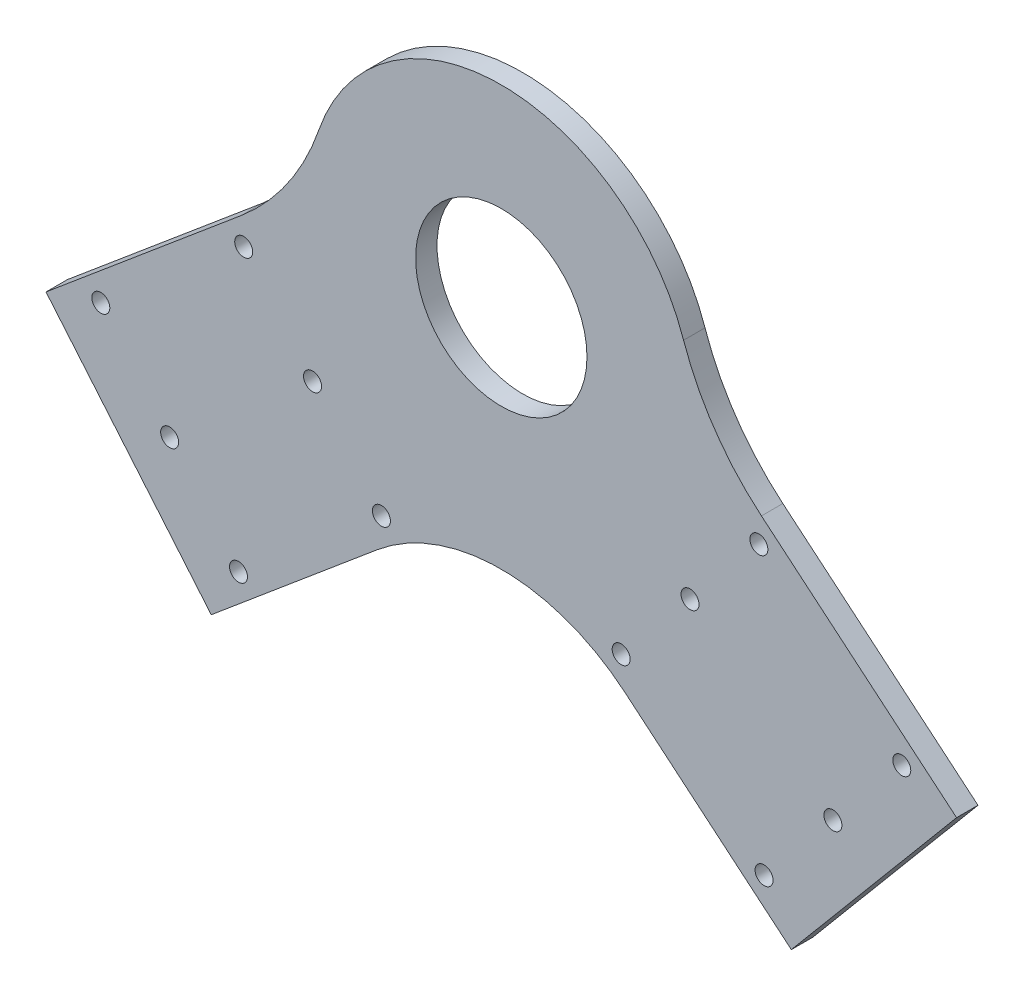
ISO-10303-21;
HEADER;
FILE_DESCRIPTION(('STEP AP214'),'2;1');
FILE_NAME('part.step','',(''),(''),'','','');
FILE_SCHEMA(('AUTOMOTIVE_DESIGN { 1 0 10303 214 1 1 1 1 }'));
ENDSEC;
DATA;
#1=APPLICATION_CONTEXT('core data for automotive mechanical design processes');
#2=APPLICATION_PROTOCOL_DEFINITION('international standard','automotive_design',2000,#1);
#3=PRODUCT_CONTEXT('',#1,'mechanical');
#4=PRODUCT('Part','Part','',(#3));
#5=PRODUCT_RELATED_PRODUCT_CATEGORY('part','',(#4));
#6=PRODUCT_DEFINITION_FORMATION('','',#4);
#7=PRODUCT_DEFINITION_CONTEXT('part definition',#1,'design');
#8=PRODUCT_DEFINITION('design','',#6,#7);
#9=PRODUCT_DEFINITION_SHAPE('','',#8);
#10=(LENGTH_UNIT() NAMED_UNIT(*) SI_UNIT(.MILLI.,.METRE.));
#11=(NAMED_UNIT(*) PLANE_ANGLE_UNIT() SI_UNIT($,.RADIAN.));
#12=(NAMED_UNIT(*) SI_UNIT($,.STERADIAN.) SOLID_ANGLE_UNIT());
#13=UNCERTAINTY_MEASURE_WITH_UNIT(LENGTH_MEASURE(1.E-05),#10,'distance_accuracy_value','');
#14=(GEOMETRIC_REPRESENTATION_CONTEXT(3) GLOBAL_UNCERTAINTY_ASSIGNED_CONTEXT((#13)) GLOBAL_UNIT_ASSIGNED_CONTEXT((#10,
#11,#12)) REPRESENTATION_CONTEXT('',''));
#15=CARTESIAN_POINT('',(0.,0.,0.));
#16=DIRECTION('',(0.,0.,1.));
#17=DIRECTION('',(1.,0.,0.));
#18=AXIS2_PLACEMENT_3D('',#15,#16,#17);
#19=CARTESIAN_POINT('',(0.,0.,5.));
#20=DIRECTION('',(0.,0.,-1.));
#21=DIRECTION('',(-1.,0.,0.));
#22=AXIS2_PLACEMENT_3D('',#19,#20,#21);
#23=CYLINDRICAL_SURFACE('',#22,45.);
#24=CARTESIAN_POINT('',(0.,0.,5.));
#25=DIRECTION('',(0.,0.,1.));
#26=DIRECTION('',(1.,0.,0.));
#27=AXIS2_PLACEMENT_3D('',#24,#25,#26);
#28=CIRCLE('',#27,45.);
#29=CARTESIAN_POINT('',(42.5490311383006,14.6485476820034,5.));
#30=VERTEX_POINT('',#29);
#31=CARTESIAN_POINT('',(-42.5490311383006,14.6485476820034,5.));
#32=VERTEX_POINT('',#31);
#33=EDGE_CURVE('E151',#30,#32,#28,.T.);
#34=ORIENTED_EDGE('',*,*,#33,.F.);
#35=DIRECTION('',(0.,0.,-1.));
#36=VECTOR('',#35,1.);
#37=CARTESIAN_POINT('',(42.5490311383006,14.6485476820034,5.));
#38=LINE('',#37,#36);
#39=CARTESIAN_POINT('',(42.5490311383006,14.6485476820034,0.));
#40=VERTEX_POINT('',#39);
#41=EDGE_CURVE('E305',#30,#40,#38,.T.);
#42=ORIENTED_EDGE('',*,*,#41,.T.);
#43=CARTESIAN_POINT('',(0.,0.,0.));
#44=DIRECTION('',(0.,0.,1.));
#45=DIRECTION('',(1.,0.,0.));
#46=AXIS2_PLACEMENT_3D('',#43,#44,#45);
#47=CIRCLE('',#46,45.);
#48=CARTESIAN_POINT('',(-42.5490311383006,14.6485476820034,0.));
#49=VERTEX_POINT('',#48);
#50=EDGE_CURVE('E224',#40,#49,#47,.T.);
#51=ORIENTED_EDGE('',*,*,#50,.T.);
#52=DIRECTION('',(0.,0.,-1.));
#53=VECTOR('',#52,1.);
#54=CARTESIAN_POINT('',(-42.5490311383006,14.6485476820034,5.));
#55=LINE('',#54,#53);
#56=EDGE_CURVE('E138',#49,#32,#55,.F.);
#57=ORIENTED_EDGE('',*,*,#56,.T.);
#58=EDGE_LOOP('',(#34,#42,#51,#57));
#59=FACE_BOUND('',#58,.T.);
#60=ADVANCED_FACE('F47',(#59),#23,.T.);
#61=CARTESIAN_POINT('',(-19.2836282905963,22.9813332935692,5.));
#62=DIRECTION('',(-0.642787609686544,0.766044443118974,0.));
#63=DIRECTION('',(-0.766044443118974,-0.642787609686544,0.));
#64=AXIS2_PLACEMENT_3D('',#61,#62,#63);
#65=PLANE('',#64);
#66=DIRECTION('',(0.766044443118974,0.642787609686544,0.));
#67=VECTOR('',#66,1.);
#68=CARTESIAN_POINT('',(-19.2836282905963,22.9813332935692,5.));
#69=LINE('',#68,#67);
#70=CARTESIAN_POINT('',(-106.261095469114,-50.0014273366601,5.));
#71=VERTEX_POINT('',#70);
#72=CARTESIAN_POINT('',(-60.7138160748421,-11.7827219957973,5.));
#73=VERTEX_POINT('',#72);
#74=EDGE_CURVE('E129',#71,#73,#69,.T.);
#75=ORIENTED_EDGE('',*,*,#74,.T.);
#76=DIRECTION('',(0.,0.,-1.));
#77=VECTOR('',#76,1.);
#78=CARTESIAN_POINT('',(-60.7138160748421,-11.7827219957973,5.));
#79=LINE('',#78,#77);
#80=CARTESIAN_POINT('',(-60.7138160748421,-11.7827219957973,0.));
#81=VERTEX_POINT('',#80);
#82=EDGE_CURVE('E312',#73,#81,#79,.T.);
#83=ORIENTED_EDGE('',*,*,#82,.T.);
#84=DIRECTION('',(0.766044443118974,0.642787609686544,0.));
#85=VECTOR('',#84,1.);
#86=CARTESIAN_POINT('',(-19.2836282905963,22.9813332935692,0.));
#87=LINE('',#86,#85);
#88=CARTESIAN_POINT('',(-106.261095469114,-50.0014273366601,0.));
#89=VERTEX_POINT('',#88);
#90=EDGE_CURVE('E132',#89,#81,#87,.T.);
#91=ORIENTED_EDGE('',*,*,#90,.F.);
#92=DIRECTION('',(0.,0.,-1.));
#93=VECTOR('',#92,1.);
#94=CARTESIAN_POINT('',(-106.261095469114,-50.0014273366601,5.));
#95=LINE('',#94,#93);
#96=EDGE_CURVE('E125',#71,#89,#95,.T.);
#97=ORIENTED_EDGE('',*,*,#96,.F.);
#98=EDGE_LOOP('',(#75,#83,#91,#97));
#99=FACE_BOUND('',#98,.T.);
#100=ADVANCED_FACE('F127',(#99),#65,.T.);
#101=CARTESIAN_POINT('',(-86.9774671785178,-72.9827606302294,5.));
#102=DIRECTION('',(-0.766044443118973,-0.642787609686545,0.));
#103=DIRECTION('',(0.642787609686545,-0.766044443118973,0.));
#104=AXIS2_PLACEMENT_3D('',#101,#102,#103);
#105=PLANE('',#104);
#106=DIRECTION('',(-0.642787609686545,0.766044443118973,0.));
#107=VECTOR('',#106,1.);
#108=CARTESIAN_POINT('',(-86.9774671785178,-72.9827606302294,0.));
#109=LINE('',#108,#107);
#110=CARTESIAN_POINT('',(-67.6938388879215,-95.9640939237985,0.));
#111=VERTEX_POINT('',#110);
#112=EDGE_CURVE('E230',#111,#89,#109,.T.);
#113=ORIENTED_EDGE('',*,*,#112,.F.);
#114=DIRECTION('',(0.,0.,-1.));
#115=VECTOR('',#114,1.);
#116=CARTESIAN_POINT('',(-67.6938388879215,-95.9640939237985,5.));
#117=LINE('',#116,#115);
#118=CARTESIAN_POINT('',(-67.6938388879215,-95.9640939237985,5.));
#119=VERTEX_POINT('',#118);
#120=EDGE_CURVE('E139',#119,#111,#117,.T.);
#121=ORIENTED_EDGE('',*,*,#120,.F.);
#122=DIRECTION('',(-0.642787609686545,0.766044443118973,0.));
#123=VECTOR('',#122,1.);
#124=CARTESIAN_POINT('',(-86.9774671785178,-72.9827606302294,5.));
#125=LINE('',#124,#123);
#126=EDGE_CURVE('E146',#119,#71,#125,.T.);
#127=ORIENTED_EDGE('',*,*,#126,.T.);
#128=ORIENTED_EDGE('',*,*,#96,.T.);
#129=EDGE_LOOP('',(#113,#121,#127,#128));
#130=FACE_BOUND('',#129,.T.);
#131=ADVANCED_FACE('F153',(#130),#105,.T.);
#132=CARTESIAN_POINT('',(19.2836282905963,-22.9813332935693,5.));
#133=DIRECTION('',(-0.642787609686543,0.766044443118975,0.));
#134=DIRECTION('',(-0.766044443118975,-0.642787609686543,0.));
#135=AXIS2_PLACEMENT_3D('',#132,#133,#134);
#136=PLANE('',#135);
#137=DIRECTION('',(0.766044443118975,0.642787609686543,0.));
#138=VECTOR('',#137,1.);
#139=CARTESIAN_POINT('',(19.2836282905963,-22.9813332935693,0.));
#140=LINE('',#139,#138);
#141=CARTESIAN_POINT('',(-28.9254424358944,-63.4335467595675,0.));
#142=VERTEX_POINT('',#141);
#143=EDGE_CURVE('E233',#111,#142,#140,.T.);
#144=ORIENTED_EDGE('',*,*,#143,.T.);
#145=DIRECTION('',(0.,0.,-1.));
#146=VECTOR('',#145,1.);
#147=CARTESIAN_POINT('',(-28.9254424358944,-63.4335467595675,5.));
#148=LINE('',#147,#146);
#149=CARTESIAN_POINT('',(-28.9254424358944,-63.4335467595675,5.));
#150=VERTEX_POINT('',#149);
#151=EDGE_CURVE('E63',#142,#150,#148,.F.);
#152=ORIENTED_EDGE('',*,*,#151,.T.);
#153=DIRECTION('',(0.766044443118975,0.642787609686543,0.));
#154=VECTOR('',#153,1.);
#155=CARTESIAN_POINT('',(19.2836282905963,-22.9813332935693,5.));
#156=LINE('',#155,#154);
#157=EDGE_CURVE('E155',#119,#150,#156,.T.);
#158=ORIENTED_EDGE('',*,*,#157,.F.);
#159=ORIENTED_EDGE('',*,*,#120,.T.);
#160=EDGE_LOOP('',(#144,#152,#158,#159));
#161=FACE_BOUND('',#160,.T.);
#162=ADVANCED_FACE('F400',(#161),#136,.F.);
#163=CARTESIAN_POINT('',(-19.2836282905963,-22.9813332935693,5.));
#164=DIRECTION('',(-0.642787609686543,-0.766044443118975,0.));
#165=DIRECTION('',(0.766044443118975,-0.642787609686543,0.));
#166=AXIS2_PLACEMENT_3D('',#163,#164,#165);
#167=PLANE('',#166);
#168=DIRECTION('',(-0.766044443118975,0.642787609686543,0.));
#169=VECTOR('',#168,1.);
#170=CARTESIAN_POINT('',(-19.2836282905963,-22.9813332935693,5.));
#171=LINE('',#170,#169);
#172=CARTESIAN_POINT('',(67.6938388879215,-95.9640939237985,5.));
#173=VERTEX_POINT('',#172);
#174=CARTESIAN_POINT('',(28.9254424358944,-63.4335467595675,5.));
#175=VERTEX_POINT('',#174);
#176=EDGE_CURVE('E158',#173,#175,#171,.T.);
#177=ORIENTED_EDGE('',*,*,#176,.T.);
#178=DIRECTION('',(0.,0.,-1.));
#179=VECTOR('',#178,1.);
#180=CARTESIAN_POINT('',(28.9254424358944,-63.4335467595675,5.));
#181=LINE('',#180,#179);
#182=CARTESIAN_POINT('',(28.9254424358944,-63.4335467595675,0.));
#183=VERTEX_POINT('',#182);
#184=EDGE_CURVE('E326',#175,#183,#181,.T.);
#185=ORIENTED_EDGE('',*,*,#184,.T.);
#186=DIRECTION('',(-0.766044443118975,0.642787609686543,0.));
#187=VECTOR('',#186,1.);
#188=CARTESIAN_POINT('',(-19.2836282905963,-22.9813332935693,0.));
#189=LINE('',#188,#187);
#190=CARTESIAN_POINT('',(67.6938388879215,-95.9640939237985,0.));
#191=VERTEX_POINT('',#190);
#192=EDGE_CURVE('E236',#191,#183,#189,.T.);
#193=ORIENTED_EDGE('',*,*,#192,.F.);
#194=DIRECTION('',(0.,0.,-1.));
#195=VECTOR('',#194,1.);
#196=CARTESIAN_POINT('',(67.6938388879215,-95.9640939237985,5.));
#197=LINE('',#196,#195);
#198=EDGE_CURVE('E298',#173,#191,#197,.T.);
#199=ORIENTED_EDGE('',*,*,#198,.F.);
#200=EDGE_LOOP('',(#177,#185,#193,#199));
#201=FACE_BOUND('',#200,.T.);
#202=ADVANCED_FACE('F335',(#201),#167,.T.);
#203=CARTESIAN_POINT('',(86.9774671785178,-72.9827606302294,5.));
#204=DIRECTION('',(-0.766044443118973,0.642787609686545,0.));
#205=DIRECTION('',(-0.642787609686545,-0.766044443118973,0.));
#206=AXIS2_PLACEMENT_3D('',#203,#204,#205);
#207=PLANE('',#206);
#208=DIRECTION('',(0.642787609686545,0.766044443118973,0.));
#209=VECTOR('',#208,1.);
#210=CARTESIAN_POINT('',(86.9774671785178,-72.9827606302294,0.));
#211=LINE('',#210,#209);
#212=CARTESIAN_POINT('',(106.261095469114,-50.0014273366601,0.));
#213=VERTEX_POINT('',#212);
#214=EDGE_CURVE('E239',#191,#213,#211,.T.);
#215=ORIENTED_EDGE('',*,*,#214,.T.);
#216=DIRECTION('',(0.,0.,-1.));
#217=VECTOR('',#216,1.);
#218=CARTESIAN_POINT('',(106.261095469114,-50.0014273366601,5.));
#219=LINE('',#218,#217);
#220=CARTESIAN_POINT('',(106.261095469114,-50.0014273366601,5.));
#221=VERTEX_POINT('',#220);
#222=EDGE_CURVE('E219',#221,#213,#219,.T.);
#223=ORIENTED_EDGE('',*,*,#222,.F.);
#224=DIRECTION('',(0.642787609686545,0.766044443118973,0.));
#225=VECTOR('',#224,1.);
#226=CARTESIAN_POINT('',(86.9774671785178,-72.9827606302294,5.));
#227=LINE('',#226,#225);
#228=EDGE_CURVE('E165',#173,#221,#227,.T.);
#229=ORIENTED_EDGE('',*,*,#228,.F.);
#230=ORIENTED_EDGE('',*,*,#198,.T.);
#231=EDGE_LOOP('',(#215,#223,#229,#230));
#232=FACE_BOUND('',#231,.T.);
#233=ADVANCED_FACE('F346',(#232),#207,.F.);
#234=CARTESIAN_POINT('',(77.4019116395307,-64.9479155091474,5.));
#235=DIRECTION('',(0.,0.,-1.));
#236=DIRECTION('',(-1.,0.,0.));
#237=AXIS2_PLACEMENT_3D('',#234,#235,#236);
#238=CYLINDRICAL_SURFACE('',#237,2.1);
#239=CARTESIAN_POINT('',(77.4019116395307,-64.9479155091474,5.));
#240=DIRECTION('',(0.,0.,1.));
#241=DIRECTION('',(1.,0.,0.));
#242=AXIS2_PLACEMENT_3D('',#239,#240,#241);
#243=CIRCLE('',#242,2.1);
#244=CARTESIAN_POINT('',(79.5019116395307,-64.9479155091474,5.));
#245=VERTEX_POINT('',#244);
#246=EDGE_CURVE('E211',#245,#245,#243,.T.);
#247=ORIENTED_EDGE('',*,*,#246,.T.);
#248=EDGE_LOOP('',(#247));
#249=FACE_BOUND('',#248,.T.);
#250=CARTESIAN_POINT('',(77.4019116395307,-64.9479155091474,0.));
#251=DIRECTION('',(0.,0.,1.));
#252=DIRECTION('',(1.,0.,0.));
#253=AXIS2_PLACEMENT_3D('',#250,#251,#252);
#254=CIRCLE('',#253,2.1);
#255=CARTESIAN_POINT('',(79.5019116395307,-64.9479155091474,0.));
#256=VERTEX_POINT('',#255);
#257=EDGE_CURVE('E286',#256,#256,#254,.T.);
#258=ORIENTED_EDGE('',*,*,#257,.F.);
#259=EDGE_LOOP('',(#258));
#260=FACE_BOUND('',#259,.T.);
#261=ADVANCED_FACE('F409',(#249,#260),#238,.F.);
#262=CARTESIAN_POINT('',(61.3322213973671,-84.0990265871218,5.));
#263=DIRECTION('',(0.,0.,-1.));
#264=DIRECTION('',(-1.,0.,0.));
#265=AXIS2_PLACEMENT_3D('',#262,#263,#264);
#266=CYLINDRICAL_SURFACE('',#265,2.1);
#267=CARTESIAN_POINT('',(61.3322213973671,-84.0990265871218,5.));
#268=DIRECTION('',(0.,0.,1.));
#269=DIRECTION('',(1.,0.,0.));
#270=AXIS2_PLACEMENT_3D('',#267,#268,#269);
#271=CIRCLE('',#270,2.1);
#272=CARTESIAN_POINT('',(63.4322213973671,-84.0990265871218,5.));
#273=VERTEX_POINT('',#272);
#274=EDGE_CURVE('E207',#273,#273,#271,.T.);
#275=ORIENTED_EDGE('',*,*,#274,.T.);
#276=EDGE_LOOP('',(#275));
#277=FACE_BOUND('',#276,.T.);
#278=CARTESIAN_POINT('',(61.3322213973671,-84.0990265871218,0.));
#279=DIRECTION('',(0.,0.,1.));
#280=DIRECTION('',(1.,0.,0.));
#281=AXIS2_PLACEMENT_3D('',#278,#279,#280);
#282=CIRCLE('',#281,2.1);
#283=CARTESIAN_POINT('',(63.4322213973671,-84.0990265871218,0.));
#284=VERTEX_POINT('',#283);
#285=EDGE_CURVE('E282',#284,#284,#282,.T.);
#286=ORIENTED_EDGE('',*,*,#285,.F.);
#287=EDGE_LOOP('',(#286));
#288=FACE_BOUND('',#287,.T.);
#289=ADVANCED_FACE('F447',(#277,#288),#266,.F.);
#290=CARTESIAN_POINT('',(60.1180268282942,-17.809831905421,5.));
#291=DIRECTION('',(0.,0.,-1.));
#292=DIRECTION('',(-1.,0.,0.));
#293=AXIS2_PLACEMENT_3D('',#290,#291,#292);
#294=CYLINDRICAL_SURFACE('',#293,2.1);
#295=CARTESIAN_POINT('',(60.1180268282942,-17.809831905421,5.));
#296=DIRECTION('',(0.,0.,1.));
#297=DIRECTION('',(1.,0.,0.));
#298=AXIS2_PLACEMENT_3D('',#295,#296,#297);
#299=CIRCLE('',#298,2.1);
#300=CARTESIAN_POINT('',(62.2180268282941,-17.809831905421,5.));
#301=VERTEX_POINT('',#300);
#302=EDGE_CURVE('E203',#301,#301,#299,.T.);
#303=ORIENTED_EDGE('',*,*,#302,.T.);
#304=EDGE_LOOP('',(#303));
#305=FACE_BOUND('',#304,.T.);
#306=CARTESIAN_POINT('',(60.1180268282942,-17.809831905421,0.));
#307=DIRECTION('',(0.,0.,1.));
#308=DIRECTION('',(1.,0.,0.));
#309=AXIS2_PLACEMENT_3D('',#306,#307,#308);
#310=CIRCLE('',#309,2.1);
#311=CARTESIAN_POINT('',(62.2180268282941,-17.809831905421,0.));
#312=VERTEX_POINT('',#311);
#313=EDGE_CURVE('E278',#312,#312,#310,.T.);
#314=ORIENTED_EDGE('',*,*,#313,.F.);
#315=EDGE_LOOP('',(#314));
#316=FACE_BOUND('',#315,.T.);
#317=ADVANCED_FACE('F443',(#305,#316),#294,.F.);
#318=CARTESIAN_POINT('',(44.0483365861306,-36.9609429833953,5.));
#319=DIRECTION('',(0.,0.,-1.));
#320=DIRECTION('',(-1.,0.,0.));
#321=AXIS2_PLACEMENT_3D('',#318,#319,#320);
#322=CYLINDRICAL_SURFACE('',#321,2.1);
#323=CARTESIAN_POINT('',(44.0483365861306,-36.9609429833953,5.));
#324=DIRECTION('',(0.,0.,1.));
#325=DIRECTION('',(1.,0.,0.));
#326=AXIS2_PLACEMENT_3D('',#323,#324,#325);
#327=CIRCLE('',#326,2.1);
#328=CARTESIAN_POINT('',(46.1483365861306,-36.9609429833953,5.));
#329=VERTEX_POINT('',#328);
#330=EDGE_CURVE('E199',#329,#329,#327,.T.);
#331=ORIENTED_EDGE('',*,*,#330,.T.);
#332=EDGE_LOOP('',(#331));
#333=FACE_BOUND('',#332,.T.);
#334=CARTESIAN_POINT('',(44.0483365861306,-36.9609429833953,0.));
#335=DIRECTION('',(0.,0.,1.));
#336=DIRECTION('',(1.,0.,0.));
#337=AXIS2_PLACEMENT_3D('',#334,#335,#336);
#338=CIRCLE('',#337,2.1);
#339=CARTESIAN_POINT('',(46.1483365861306,-36.9609429833953,0.));
#340=VERTEX_POINT('',#339);
#341=EDGE_CURVE('E274',#340,#340,#338,.T.);
#342=ORIENTED_EDGE('',*,*,#341,.F.);
#343=EDGE_LOOP('',(#342));
#344=FACE_BOUND('',#343,.T.);
#345=ADVANCED_FACE('F439',(#333,#344),#322,.F.);
#346=CARTESIAN_POINT('',(27.978646343967,-56.1120540613696,5.));
#347=DIRECTION('',(0.,0.,-1.));
#348=DIRECTION('',(-1.,0.,0.));
#349=AXIS2_PLACEMENT_3D('',#346,#347,#348);
#350=CYLINDRICAL_SURFACE('',#349,2.1);
#351=CARTESIAN_POINT('',(27.978646343967,-56.1120540613696,5.));
#352=DIRECTION('',(0.,0.,1.));
#353=DIRECTION('',(1.,0.,0.));
#354=AXIS2_PLACEMENT_3D('',#351,#352,#353);
#355=CIRCLE('',#354,2.1);
#356=CARTESIAN_POINT('',(30.078646343967,-56.1120540613696,5.));
#357=VERTEX_POINT('',#356);
#358=EDGE_CURVE('E195',#357,#357,#355,.T.);
#359=ORIENTED_EDGE('',*,*,#358,.T.);
#360=EDGE_LOOP('',(#359));
#361=FACE_BOUND('',#360,.T.);
#362=CARTESIAN_POINT('',(27.978646343967,-56.1120540613696,0.));
#363=DIRECTION('',(0.,0.,1.));
#364=DIRECTION('',(1.,0.,0.));
#365=AXIS2_PLACEMENT_3D('',#362,#363,#364);
#366=CIRCLE('',#365,2.1);
#367=CARTESIAN_POINT('',(30.078646343967,-56.1120540613696,0.));
#368=VERTEX_POINT('',#367);
#369=EDGE_CURVE('E270',#368,#368,#366,.T.);
#370=ORIENTED_EDGE('',*,*,#369,.F.);
#371=EDGE_LOOP('',(#370));
#372=FACE_BOUND('',#371,.T.);
#373=ADVANCED_FACE('F435',(#361,#372),#350,.F.);
#374=CARTESIAN_POINT('',(-60.1180268282942,-17.809831905421,5.));
#375=DIRECTION('',(0.,0.,-1.));
#376=DIRECTION('',(-1.,0.,0.));
#377=AXIS2_PLACEMENT_3D('',#374,#375,#376);
#378=CYLINDRICAL_SURFACE('',#377,2.1);
#379=CARTESIAN_POINT('',(-60.1180268282942,-17.809831905421,5.));
#380=DIRECTION('',(0.,0.,1.));
#381=DIRECTION('',(1.,0.,0.));
#382=AXIS2_PLACEMENT_3D('',#379,#380,#381);
#383=CIRCLE('',#382,2.1);
#384=CARTESIAN_POINT('',(-58.0180268282942,-17.809831905421,5.));
#385=VERTEX_POINT('',#384);
#386=EDGE_CURVE('E191',#385,#385,#383,.F.);
#387=ORIENTED_EDGE('',*,*,#386,.F.);
#388=EDGE_LOOP('',(#387));
#389=FACE_BOUND('',#388,.T.);
#390=CARTESIAN_POINT('',(-60.1180268282942,-17.809831905421,0.));
#391=DIRECTION('',(0.,0.,1.));
#392=DIRECTION('',(1.,0.,0.));
#393=AXIS2_PLACEMENT_3D('',#390,#391,#392);
#394=CIRCLE('',#393,2.1);
#395=CARTESIAN_POINT('',(-58.0180268282942,-17.809831905421,0.));
#396=VERTEX_POINT('',#395);
#397=EDGE_CURVE('E266',#396,#396,#394,.F.);
#398=ORIENTED_EDGE('',*,*,#397,.T.);
#399=EDGE_LOOP('',(#398));
#400=FACE_BOUND('',#399,.T.);
#401=ADVANCED_FACE('F431',(#389,#400),#378,.F.);
#402=CARTESIAN_POINT('',(-27.978646343967,-56.1120540613696,5.));
#403=DIRECTION('',(0.,0.,-1.));
#404=DIRECTION('',(-1.,0.,0.));
#405=AXIS2_PLACEMENT_3D('',#402,#403,#404);
#406=CYLINDRICAL_SURFACE('',#405,2.1);
#407=CARTESIAN_POINT('',(-27.978646343967,-56.1120540613696,5.));
#408=DIRECTION('',(0.,0.,1.));
#409=DIRECTION('',(1.,0.,0.));
#410=AXIS2_PLACEMENT_3D('',#407,#408,#409);
#411=CIRCLE('',#410,2.1);
#412=CARTESIAN_POINT('',(-25.878646343967,-56.1120540613696,5.));
#413=VERTEX_POINT('',#412);
#414=EDGE_CURVE('E187',#413,#413,#411,.F.);
#415=ORIENTED_EDGE('',*,*,#414,.F.);
#416=EDGE_LOOP('',(#415));
#417=FACE_BOUND('',#416,.T.);
#418=CARTESIAN_POINT('',(-27.978646343967,-56.1120540613696,0.));
#419=DIRECTION('',(0.,0.,1.));
#420=DIRECTION('',(1.,0.,0.));
#421=AXIS2_PLACEMENT_3D('',#418,#419,#420);
#422=CIRCLE('',#421,2.1);
#423=CARTESIAN_POINT('',(-25.878646343967,-56.1120540613696,0.));
#424=VERTEX_POINT('',#423);
#425=EDGE_CURVE('E262',#424,#424,#422,.F.);
#426=ORIENTED_EDGE('',*,*,#425,.T.);
#427=EDGE_LOOP('',(#426));
#428=FACE_BOUND('',#427,.T.);
#429=ADVANCED_FACE('F427',(#417,#428),#406,.F.);
#430=CARTESIAN_POINT('',(-77.4019116395307,-64.9479155091474,5.));
#431=DIRECTION('',(0.,0.,-1.));
#432=DIRECTION('',(-1.,0.,0.));
#433=AXIS2_PLACEMENT_3D('',#430,#431,#432);
#434=CYLINDRICAL_SURFACE('',#433,2.1);
#435=CARTESIAN_POINT('',(-77.4019116395307,-64.9479155091474,5.));
#436=DIRECTION('',(0.,0.,1.));
#437=DIRECTION('',(1.,0.,0.));
#438=AXIS2_PLACEMENT_3D('',#435,#436,#437);
#439=CIRCLE('',#438,2.1);
#440=CARTESIAN_POINT('',(-75.3019116395307,-64.9479155091474,5.));
#441=VERTEX_POINT('',#440);
#442=EDGE_CURVE('E183',#441,#441,#439,.F.);
#443=ORIENTED_EDGE('',*,*,#442,.F.);
#444=EDGE_LOOP('',(#443));
#445=FACE_BOUND('',#444,.T.);
#446=CARTESIAN_POINT('',(-77.4019116395307,-64.9479155091474,0.));
#447=DIRECTION('',(0.,0.,1.));
#448=DIRECTION('',(1.,0.,0.));
#449=AXIS2_PLACEMENT_3D('',#446,#447,#448);
#450=CIRCLE('',#449,2.1);
#451=CARTESIAN_POINT('',(-75.3019116395307,-64.9479155091474,0.));
#452=VERTEX_POINT('',#451);
#453=EDGE_CURVE('E258',#452,#452,#450,.F.);
#454=ORIENTED_EDGE('',*,*,#453,.T.);
#455=EDGE_LOOP('',(#454));
#456=FACE_BOUND('',#455,.T.);
#457=ADVANCED_FACE('F423',(#445,#456),#434,.F.);
#458=CARTESIAN_POINT('',(-61.3322213973671,-84.0990265871218,5.));
#459=DIRECTION('',(0.,0.,-1.));
#460=DIRECTION('',(-1.,0.,0.));
#461=AXIS2_PLACEMENT_3D('',#458,#459,#460);
#462=CYLINDRICAL_SURFACE('',#461,2.1);
#463=CARTESIAN_POINT('',(-61.3322213973671,-84.0990265871218,5.));
#464=DIRECTION('',(0.,0.,1.));
#465=DIRECTION('',(1.,0.,0.));
#466=AXIS2_PLACEMENT_3D('',#463,#464,#465);
#467=CIRCLE('',#466,2.1);
#468=CARTESIAN_POINT('',(-59.2322213973671,-84.0990265871218,5.));
#469=VERTEX_POINT('',#468);
#470=EDGE_CURVE('E179',#469,#469,#467,.F.);
#471=ORIENTED_EDGE('',*,*,#470,.F.);
#472=EDGE_LOOP('',(#471));
#473=FACE_BOUND('',#472,.T.);
#474=CARTESIAN_POINT('',(-61.3322213973671,-84.0990265871218,0.));
#475=DIRECTION('',(0.,0.,1.));
#476=DIRECTION('',(1.,0.,0.));
#477=AXIS2_PLACEMENT_3D('',#474,#475,#476);
#478=CIRCLE('',#477,2.1);
#479=CARTESIAN_POINT('',(-59.2322213973671,-84.0990265871218,0.));
#480=VERTEX_POINT('',#479);
#481=EDGE_CURVE('E254',#480,#480,#478,.F.);
#482=ORIENTED_EDGE('',*,*,#481,.T.);
#483=EDGE_LOOP('',(#482));
#484=FACE_BOUND('',#483,.T.);
#485=ADVANCED_FACE('F419',(#473,#484),#462,.F.);
#486=CARTESIAN_POINT('',(-93.4716018816943,-45.7968044311731,5.));
#487=DIRECTION('',(0.,0.,-1.));
#488=DIRECTION('',(-1.,0.,0.));
#489=AXIS2_PLACEMENT_3D('',#486,#487,#488);
#490=CYLINDRICAL_SURFACE('',#489,2.1);
#491=CARTESIAN_POINT('',(-93.4716018816943,-45.7968044311731,5.));
#492=DIRECTION('',(0.,0.,1.));
#493=DIRECTION('',(1.,0.,0.));
#494=AXIS2_PLACEMENT_3D('',#491,#492,#493);
#495=CIRCLE('',#494,2.1);
#496=CARTESIAN_POINT('',(-91.3716018816943,-45.7968044311731,5.));
#497=VERTEX_POINT('',#496);
#498=EDGE_CURVE('E175',#497,#497,#495,.F.);
#499=ORIENTED_EDGE('',*,*,#498,.F.);
#500=EDGE_LOOP('',(#499));
#501=FACE_BOUND('',#500,.T.);
#502=CARTESIAN_POINT('',(-93.4716018816943,-45.7968044311731,0.));
#503=DIRECTION('',(0.,0.,1.));
#504=DIRECTION('',(1.,0.,0.));
#505=AXIS2_PLACEMENT_3D('',#502,#503,#504);
#506=CIRCLE('',#505,2.1);
#507=CARTESIAN_POINT('',(-91.3716018816943,-45.7968044311731,0.));
#508=VERTEX_POINT('',#507);
#509=EDGE_CURVE('E250',#508,#508,#506,.F.);
#510=ORIENTED_EDGE('',*,*,#509,.T.);
#511=EDGE_LOOP('',(#510));
#512=FACE_BOUND('',#511,.T.);
#513=ADVANCED_FACE('F415',(#501,#512),#490,.F.);
#514=CARTESIAN_POINT('',(-44.0483365861306,-36.9609429833953,5.));
#515=DIRECTION('',(0.,0.,-1.));
#516=DIRECTION('',(-1.,0.,0.));
#517=AXIS2_PLACEMENT_3D('',#514,#515,#516);
#518=CYLINDRICAL_SURFACE('',#517,2.1);
#519=CARTESIAN_POINT('',(-44.0483365861306,-36.9609429833953,5.));
#520=DIRECTION('',(0.,0.,1.));
#521=DIRECTION('',(1.,0.,0.));
#522=AXIS2_PLACEMENT_3D('',#519,#520,#521);
#523=CIRCLE('',#522,2.1);
#524=CARTESIAN_POINT('',(-41.9483365861306,-36.9609429833953,5.));
#525=VERTEX_POINT('',#524);
#526=EDGE_CURVE('E171',#525,#525,#523,.F.);
#527=ORIENTED_EDGE('',*,*,#526,.F.);
#528=EDGE_LOOP('',(#527));
#529=FACE_BOUND('',#528,.T.);
#530=CARTESIAN_POINT('',(-44.0483365861306,-36.9609429833953,0.));
#531=DIRECTION('',(0.,0.,1.));
#532=DIRECTION('',(1.,0.,0.));
#533=AXIS2_PLACEMENT_3D('',#530,#531,#532);
#534=CIRCLE('',#533,2.1);
#535=CARTESIAN_POINT('',(-41.9483365861306,-36.9609429833953,0.));
#536=VERTEX_POINT('',#535);
#537=EDGE_CURVE('E246',#536,#536,#534,.F.);
#538=ORIENTED_EDGE('',*,*,#537,.T.);
#539=EDGE_LOOP('',(#538));
#540=FACE_BOUND('',#539,.T.);
#541=ADVANCED_FACE('F412',(#529,#540),#518,.F.);
#542=CARTESIAN_POINT('',(19.2836282905963,22.9813332935692,5.));
#543=DIRECTION('',(-0.642787609686544,-0.766044443118974,0.));
#544=DIRECTION('',(0.766044443118974,-0.642787609686544,0.));
#545=AXIS2_PLACEMENT_3D('',#542,#543,#544);
#546=PLANE('',#545);
#547=DIRECTION('',(-0.766044443118974,0.642787609686544,0.));
#548=VECTOR('',#547,1.);
#549=CARTESIAN_POINT('',(19.2836282905963,22.9813332935692,0.));
#550=LINE('',#549,#548);
#551=CARTESIAN_POINT('',(60.7138160748421,-11.7827219957973,0.));
#552=VERTEX_POINT('',#551);
#553=EDGE_CURVE('E242',#213,#552,#550,.T.);
#554=ORIENTED_EDGE('',*,*,#553,.T.);
#555=DIRECTION('',(0.,0.,1.));
#556=VECTOR('',#555,1.);
#557=CARTESIAN_POINT('',(60.7138160748421,-11.7827219957973,5.));
#558=LINE('',#557,#556);
#559=CARTESIAN_POINT('',(60.7138160748421,-11.7827219957973,5.));
#560=VERTEX_POINT('',#559);
#561=EDGE_CURVE('E309',#552,#560,#558,.T.);
#562=ORIENTED_EDGE('',*,*,#561,.T.);
#563=DIRECTION('',(-0.766044443118974,0.642787609686544,0.));
#564=VECTOR('',#563,1.);
#565=CARTESIAN_POINT('',(19.2836282905963,22.9813332935692,5.));
#566=LINE('',#565,#564);
#567=EDGE_CURVE('E168',#221,#560,#566,.T.);
#568=ORIENTED_EDGE('',*,*,#567,.F.);
#569=ORIENTED_EDGE('',*,*,#222,.T.);
#570=EDGE_LOOP('',(#554,#562,#568,#569));
#571=FACE_BOUND('',#570,.T.);
#572=ADVANCED_FACE('F350',(#571),#546,.F.);
#573=CARTESIAN_POINT('',(0.,0.,5.));
#574=DIRECTION('',(0.,0.,-1.));
#575=DIRECTION('',(-1.,0.,0.));
#576=AXIS2_PLACEMENT_3D('',#573,#574,#575);
#577=CYLINDRICAL_SURFACE('',#576,20.);
#578=CARTESIAN_POINT('',(0.,0.,5.));
#579=DIRECTION('',(0.,0.,1.));
#580=DIRECTION('',(1.,0.,0.));
#581=AXIS2_PLACEMENT_3D('',#578,#579,#580);
#582=CIRCLE('',#581,20.);
#583=CARTESIAN_POINT('',(20.,0.,5.));
#584=VERTEX_POINT('',#583);
#585=EDGE_CURVE('E294',#584,#584,#582,.T.);
#586=ORIENTED_EDGE('',*,*,#585,.T.);
#587=EDGE_LOOP('',(#586));
#588=FACE_BOUND('',#587,.T.);
#589=CARTESIAN_POINT('',(0.,0.,0.));
#590=DIRECTION('',(0.,0.,1.));
#591=DIRECTION('',(1.,0.,0.));
#592=AXIS2_PLACEMENT_3D('',#589,#590,#591);
#593=CIRCLE('',#592,20.);
#594=CARTESIAN_POINT('',(20.,0.,0.));
#595=VERTEX_POINT('',#594);
#596=EDGE_CURVE('E220',#595,#595,#593,.T.);
#597=ORIENTED_EDGE('',*,*,#596,.F.);
#598=EDGE_LOOP('',(#597));
#599=FACE_BOUND('',#598,.T.);
#600=ADVANCED_FACE('F367',(#588,#599),#577,.F.);
#601=CARTESIAN_POINT('',(93.4716018816943,-45.7968044311731,5.));
#602=DIRECTION('',(0.,0.,-1.));
#603=DIRECTION('',(-1.,0.,0.));
#604=AXIS2_PLACEMENT_3D('',#601,#602,#603);
#605=CYLINDRICAL_SURFACE('',#604,2.1);
#606=CARTESIAN_POINT('',(93.4716018816943,-45.7968044311731,5.));
#607=DIRECTION('',(0.,0.,1.));
#608=DIRECTION('',(1.,0.,0.));
#609=AXIS2_PLACEMENT_3D('',#606,#607,#608);
#610=CIRCLE('',#609,2.1);
#611=CARTESIAN_POINT('',(95.5716018816943,-45.7968044311731,5.));
#612=VERTEX_POINT('',#611);
#613=EDGE_CURVE('E215',#612,#612,#610,.T.);
#614=ORIENTED_EDGE('',*,*,#613,.T.);
#615=EDGE_LOOP('',(#614));
#616=FACE_BOUND('',#615,.T.);
#617=CARTESIAN_POINT('',(93.4716018816943,-45.7968044311731,0.));
#618=DIRECTION('',(0.,0.,1.));
#619=DIRECTION('',(1.,0.,0.));
#620=AXIS2_PLACEMENT_3D('',#617,#618,#619);
#621=CIRCLE('',#620,2.1);
#622=CARTESIAN_POINT('',(95.5716018816943,-45.7968044311731,0.));
#623=VERTEX_POINT('',#622);
#624=EDGE_CURVE('E290',#623,#623,#621,.T.);
#625=ORIENTED_EDGE('',*,*,#624,.F.);
#626=EDGE_LOOP('',(#625));
#627=FACE_BOUND('',#626,.T.);
#628=ADVANCED_FACE('F371',(#616,#627),#605,.F.);
#629=CARTESIAN_POINT('',(0.,0.,5.));
#630=DIRECTION('',(0.,0.,1.));
#631=DIRECTION('',(1.,0.,0.));
#632=AXIS2_PLACEMENT_3D('',#629,#630,#631);
#633=PLANE('',#632);
#634=ORIENTED_EDGE('',*,*,#585,.F.);
#635=EDGE_LOOP('',(#634));
#636=FACE_BOUND('',#635,.T.);
#637=ORIENTED_EDGE('',*,*,#567,.T.);
#638=CARTESIAN_POINT('',(99.2810726560347,34.1799445913412,5.));
#639=DIRECTION('',(0.,0.,1.));
#640=DIRECTION('',(1.,0.,0.));
#641=AXIS2_PLACEMENT_3D('',#638,#639,#640);
#642=CIRCLE('',#641,60.);
#643=EDGE_CURVE('E318',#560,#30,#642,.F.);
#644=ORIENTED_EDGE('',*,*,#643,.T.);
#645=ORIENTED_EDGE('',*,*,#33,.T.);
#646=CARTESIAN_POINT('',(-99.2810726560347,34.1799445913412,5.));
#647=DIRECTION('',(0.,0.,1.));
#648=DIRECTION('',(1.,0.,0.));
#649=AXIS2_PLACEMENT_3D('',#646,#647,#648);
#650=CIRCLE('',#649,60.);
#651=EDGE_CURVE('E149',#32,#73,#650,.F.);
#652=ORIENTED_EDGE('',*,*,#651,.T.);
#653=ORIENTED_EDGE('',*,*,#74,.F.);
#654=ORIENTED_EDGE('',*,*,#126,.F.);
#655=ORIENTED_EDGE('',*,*,#157,.T.);
#656=CARTESIAN_POINT('',(0.,-97.9055466999213,5.));
#657=DIRECTION('',(0.,0.,1.));
#658=DIRECTION('',(1.,0.,0.));
#659=AXIS2_PLACEMENT_3D('',#656,#657,#658);
#660=CIRCLE('',#659,45.);
#661=EDGE_CURVE('E11',#150,#175,#660,.F.);
#662=ORIENTED_EDGE('',*,*,#661,.T.);
#663=ORIENTED_EDGE('',*,*,#176,.F.);
#664=ORIENTED_EDGE('',*,*,#228,.T.);
#665=EDGE_LOOP('',(#637,#644,#645,#652,#653,#654,#655,#662,#663,#664));
#666=FACE_BOUND('',#665,.T.);
#667=ORIENTED_EDGE('',*,*,#526,.T.);
#668=EDGE_LOOP('',(#667));
#669=FACE_BOUND('',#668,.T.);
#670=ORIENTED_EDGE('',*,*,#498,.T.);
#671=EDGE_LOOP('',(#670));
#672=FACE_BOUND('',#671,.T.);
#673=ORIENTED_EDGE('',*,*,#470,.T.);
#674=EDGE_LOOP('',(#673));
#675=FACE_BOUND('',#674,.T.);
#676=ORIENTED_EDGE('',*,*,#442,.T.);
#677=EDGE_LOOP('',(#676));
#678=FACE_BOUND('',#677,.T.);
#679=ORIENTED_EDGE('',*,*,#414,.T.);
#680=EDGE_LOOP('',(#679));
#681=FACE_BOUND('',#680,.T.);
#682=ORIENTED_EDGE('',*,*,#386,.T.);
#683=EDGE_LOOP('',(#682));
#684=FACE_BOUND('',#683,.T.);
#685=ORIENTED_EDGE('',*,*,#358,.F.);
#686=EDGE_LOOP('',(#685));
#687=FACE_BOUND('',#686,.T.);
#688=ORIENTED_EDGE('',*,*,#330,.F.);
#689=EDGE_LOOP('',(#688));
#690=FACE_BOUND('',#689,.T.);
#691=ORIENTED_EDGE('',*,*,#302,.F.);
#692=EDGE_LOOP('',(#691));
#693=FACE_BOUND('',#692,.T.);
#694=ORIENTED_EDGE('',*,*,#274,.F.);
#695=EDGE_LOOP('',(#694));
#696=FACE_BOUND('',#695,.T.);
#697=ORIENTED_EDGE('',*,*,#246,.F.);
#698=EDGE_LOOP('',(#697));
#699=FACE_BOUND('',#698,.T.);
#700=ORIENTED_EDGE('',*,*,#613,.F.);
#701=EDGE_LOOP('',(#700));
#702=FACE_BOUND('',#701,.T.);
#703=ADVANCED_FACE('F144',(#636,#666,#669,#672,#675,#678,#681,#684,#687,#690,#693,#696,#699,
#702),#633,.T.);
#704=CARTESIAN_POINT('',(0.,0.,0.));
#705=DIRECTION('',(0.,0.,1.));
#706=DIRECTION('',(1.,0.,0.));
#707=AXIS2_PLACEMENT_3D('',#704,#705,#706);
#708=PLANE('',#707);
#709=ORIENTED_EDGE('',*,*,#596,.T.);
#710=EDGE_LOOP('',(#709));
#711=FACE_BOUND('',#710,.T.);
#712=ORIENTED_EDGE('',*,*,#50,.F.);
#713=CARTESIAN_POINT('',(99.2810726560347,34.1799445913412,0.));
#714=DIRECTION('',(0.,0.,1.));
#715=DIRECTION('',(1.,0.,0.));
#716=AXIS2_PLACEMENT_3D('',#713,#714,#715);
#717=CIRCLE('',#716,60.);
#718=EDGE_CURVE('E315',#40,#552,#717,.T.);
#719=ORIENTED_EDGE('',*,*,#718,.T.);
#720=ORIENTED_EDGE('',*,*,#553,.F.);
#721=ORIENTED_EDGE('',*,*,#214,.F.);
#722=ORIENTED_EDGE('',*,*,#192,.T.);
#723=CARTESIAN_POINT('',(0.,-97.9055466999213,0.));
#724=DIRECTION('',(0.,0.,1.));
#725=DIRECTION('',(1.,0.,0.));
#726=AXIS2_PLACEMENT_3D('',#723,#724,#725);
#727=CIRCLE('',#726,45.);
#728=EDGE_CURVE('E56',#183,#142,#727,.T.);
#729=ORIENTED_EDGE('',*,*,#728,.T.);
#730=ORIENTED_EDGE('',*,*,#143,.F.);
#731=ORIENTED_EDGE('',*,*,#112,.T.);
#732=ORIENTED_EDGE('',*,*,#90,.T.);
#733=CARTESIAN_POINT('',(-99.2810726560347,34.1799445913412,0.));
#734=DIRECTION('',(0.,0.,1.));
#735=DIRECTION('',(1.,0.,0.));
#736=AXIS2_PLACEMENT_3D('',#733,#734,#735);
#737=CIRCLE('',#736,60.);
#738=EDGE_CURVE('E321',#81,#49,#737,.T.);
#739=ORIENTED_EDGE('',*,*,#738,.T.);
#740=EDGE_LOOP('',(#712,#719,#720,#721,#722,#729,#730,#731,#732,#739));
#741=FACE_BOUND('',#740,.T.);
#742=ORIENTED_EDGE('',*,*,#537,.F.);
#743=EDGE_LOOP('',(#742));
#744=FACE_BOUND('',#743,.T.);
#745=ORIENTED_EDGE('',*,*,#509,.F.);
#746=EDGE_LOOP('',(#745));
#747=FACE_BOUND('',#746,.T.);
#748=ORIENTED_EDGE('',*,*,#481,.F.);
#749=EDGE_LOOP('',(#748));
#750=FACE_BOUND('',#749,.T.);
#751=ORIENTED_EDGE('',*,*,#453,.F.);
#752=EDGE_LOOP('',(#751));
#753=FACE_BOUND('',#752,.T.);
#754=ORIENTED_EDGE('',*,*,#425,.F.);
#755=EDGE_LOOP('',(#754));
#756=FACE_BOUND('',#755,.T.);
#757=ORIENTED_EDGE('',*,*,#397,.F.);
#758=EDGE_LOOP('',(#757));
#759=FACE_BOUND('',#758,.T.);
#760=ORIENTED_EDGE('',*,*,#369,.T.);
#761=EDGE_LOOP('',(#760));
#762=FACE_BOUND('',#761,.T.);
#763=ORIENTED_EDGE('',*,*,#341,.T.);
#764=EDGE_LOOP('',(#763));
#765=FACE_BOUND('',#764,.T.);
#766=ORIENTED_EDGE('',*,*,#313,.T.);
#767=EDGE_LOOP('',(#766));
#768=FACE_BOUND('',#767,.T.);
#769=ORIENTED_EDGE('',*,*,#285,.T.);
#770=EDGE_LOOP('',(#769));
#771=FACE_BOUND('',#770,.T.);
#772=ORIENTED_EDGE('',*,*,#257,.T.);
#773=EDGE_LOOP('',(#772));
#774=FACE_BOUND('',#773,.T.);
#775=ORIENTED_EDGE('',*,*,#624,.T.);
#776=EDGE_LOOP('',(#775));
#777=FACE_BOUND('',#776,.T.);
#778=ADVANCED_FACE('F341',(#711,#741,#744,#747,#750,#753,#756,#759,#762,#765,#768,#771,#774,
#777),#708,.F.);
#779=CARTESIAN_POINT('',(99.2810726560347,34.1799445913412,5.));
#780=DIRECTION('',(0.,0.,-1.));
#781=DIRECTION('',(-1.,0.,0.));
#782=AXIS2_PLACEMENT_3D('',#779,#780,#781);
#783=CYLINDRICAL_SURFACE('',#782,60.);
#784=ORIENTED_EDGE('',*,*,#643,.F.);
#785=ORIENTED_EDGE('',*,*,#561,.F.);
#786=ORIENTED_EDGE('',*,*,#718,.F.);
#787=ORIENTED_EDGE('',*,*,#41,.F.);
#788=EDGE_LOOP('',(#784,#785,#786,#787));
#789=FACE_BOUND('',#788,.T.);
#790=ADVANCED_FACE('F356',(#789),#783,.F.);
#791=CARTESIAN_POINT('',(-99.2810726560347,34.1799445913412,5.));
#792=DIRECTION('',(0.,0.,-1.));
#793=DIRECTION('',(-1.,0.,0.));
#794=AXIS2_PLACEMENT_3D('',#791,#792,#793);
#795=CYLINDRICAL_SURFACE('',#794,60.);
#796=ORIENTED_EDGE('',*,*,#651,.F.);
#797=ORIENTED_EDGE('',*,*,#56,.F.);
#798=ORIENTED_EDGE('',*,*,#738,.F.);
#799=ORIENTED_EDGE('',*,*,#82,.F.);
#800=EDGE_LOOP('',(#796,#797,#798,#799));
#801=FACE_BOUND('',#800,.T.);
#802=ADVANCED_FACE('F360',(#801),#795,.F.);
#803=CARTESIAN_POINT('',(0.,-97.9055466999213,5.));
#804=DIRECTION('',(0.,0.,-1.));
#805=DIRECTION('',(-1.,0.,0.));
#806=AXIS2_PLACEMENT_3D('',#803,#804,#805);
#807=CYLINDRICAL_SURFACE('',#806,45.);
#808=ORIENTED_EDGE('',*,*,#661,.F.);
#809=ORIENTED_EDGE('',*,*,#151,.F.);
#810=ORIENTED_EDGE('',*,*,#728,.F.);
#811=ORIENTED_EDGE('',*,*,#184,.F.);
#812=EDGE_LOOP('',(#808,#809,#810,#811));
#813=FACE_BOUND('',#812,.T.);
#814=ADVANCED_FACE('F49',(#813),#807,.F.);
#815=CLOSED_SHELL('',(#60,#100,#131,#162,#202,#233,#261,#289,#317,#345,#373,#401,#429,#457,#485,
#513,#541,#572,#600,#628,#703,#778,#790,#802,#814));
#816=MANIFOLD_SOLID_BREP('B2',#815);
#817=ADVANCED_BREP_SHAPE_REPRESENTATION('',(#18,#816),#14);
#818=SHAPE_DEFINITION_REPRESENTATION(#9,#817);
ENDSEC;
END-ISO-10303-21;
